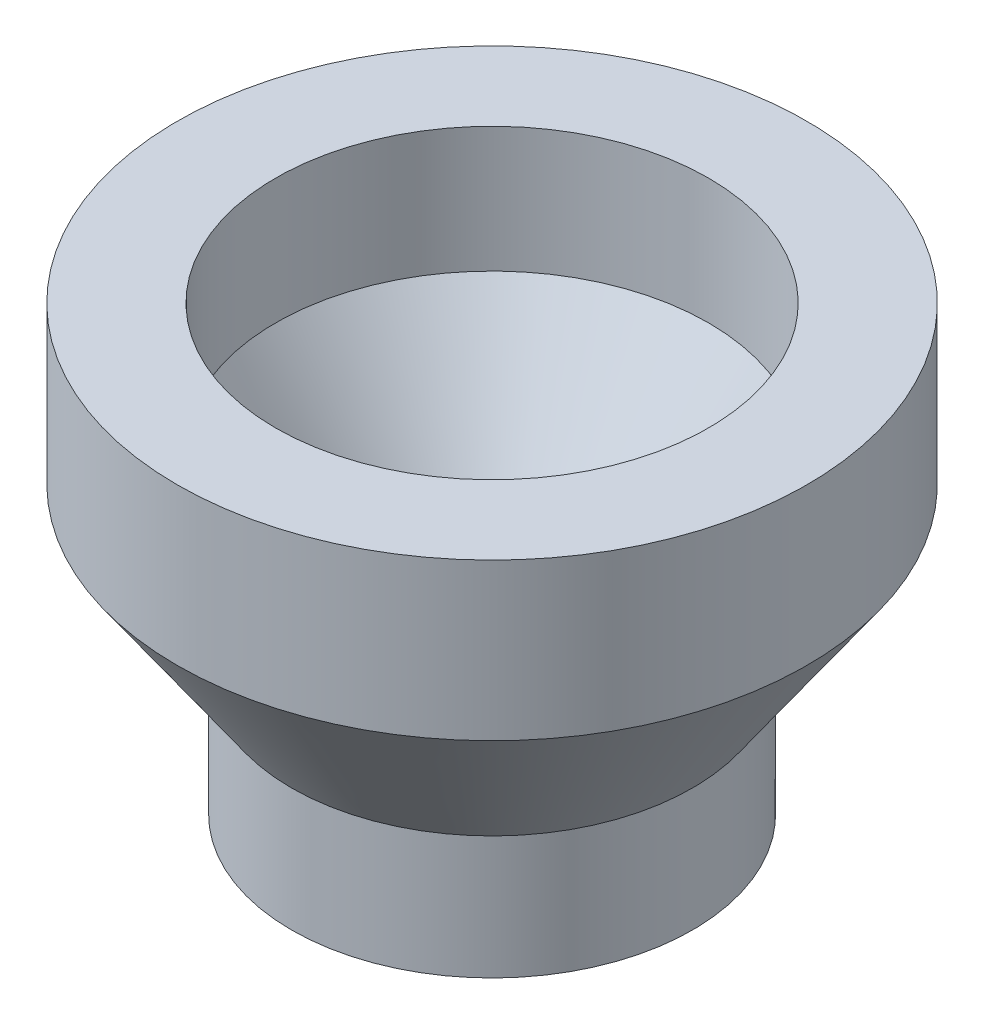
ISO-10303-21;
HEADER;
FILE_DESCRIPTION(('STEP AP214'),'2;1');
FILE_NAME('part.step','',(''),(''),'','','');
FILE_SCHEMA(('AUTOMOTIVE_DESIGN { 1 0 10303 214 1 1 1 1 }'));
ENDSEC;
DATA;
#1=APPLICATION_CONTEXT('core data for automotive mechanical design processes');
#2=APPLICATION_PROTOCOL_DEFINITION('international standard','automotive_design',2000,#1);
#3=PRODUCT_CONTEXT('',#1,'mechanical');
#4=PRODUCT('Part','Part','',(#3));
#5=PRODUCT_RELATED_PRODUCT_CATEGORY('part','',(#4));
#6=PRODUCT_DEFINITION_FORMATION('','',#4);
#7=PRODUCT_DEFINITION_CONTEXT('part definition',#1,'design');
#8=PRODUCT_DEFINITION('design','',#6,#7);
#9=PRODUCT_DEFINITION_SHAPE('','',#8);
#10=(LENGTH_UNIT() NAMED_UNIT(*) SI_UNIT(.MILLI.,.METRE.));
#11=(NAMED_UNIT(*) PLANE_ANGLE_UNIT() SI_UNIT($,.RADIAN.));
#12=(NAMED_UNIT(*) SI_UNIT($,.STERADIAN.) SOLID_ANGLE_UNIT());
#13=UNCERTAINTY_MEASURE_WITH_UNIT(LENGTH_MEASURE(1.E-05),#10,'distance_accuracy_value','');
#14=(GEOMETRIC_REPRESENTATION_CONTEXT(3) GLOBAL_UNCERTAINTY_ASSIGNED_CONTEXT((#13)) GLOBAL_UNIT_ASSIGNED_CONTEXT((#10,
#11,#12)) REPRESENTATION_CONTEXT('',''));
#15=CARTESIAN_POINT('',(0.,0.,0.));
#16=DIRECTION('',(0.,0.,1.));
#17=DIRECTION('',(1.,0.,0.));
#18=AXIS2_PLACEMENT_3D('',#15,#16,#17);
#19=CARTESIAN_POINT('',(-4.07499999999999,25.4372825671926,0.));
#20=DIRECTION('',(0.,-1.,0.));
#21=DIRECTION('',(0.,0.,-1.));
#22=AXIS2_PLACEMENT_3D('',#19,#20,#21);
#23=PLANE('',#22);
#24=CARTESIAN_POINT('',(0.,25.4372825671926,0.));
#25=DIRECTION('',(0.,1.,0.));
#26=DIRECTION('',(0.,0.,1.));
#27=AXIS2_PLACEMENT_3D('',#24,#25,#26);
#28=CIRCLE('',#27,2.57499999999999);
#29=CARTESIAN_POINT('',(0.,25.4372825671926,2.57499999999999));
#30=VERTEX_POINT('',#29);
#31=EDGE_CURVE('E10',#30,#30,#28,.T.);
#32=ORIENTED_EDGE('',*,*,#31,.T.);
#33=EDGE_LOOP('',(#32));
#34=FACE_BOUND('',#33,.T.);
#35=CARTESIAN_POINT('',(0.,25.4372825671926,0.));
#36=DIRECTION('',(0.,1.,0.));
#37=DIRECTION('',(0.,0.,1.));
#38=AXIS2_PLACEMENT_3D('',#35,#36,#37);
#39=CIRCLE('',#38,4.07499999999999);
#40=CARTESIAN_POINT('',(0.,25.4372825671926,4.07499999999999));
#41=VERTEX_POINT('',#40);
#42=EDGE_CURVE('E65',#41,#41,#39,.T.);
#43=ORIENTED_EDGE('',*,*,#42,.F.);
#44=EDGE_LOOP('',(#43));
#45=FACE_BOUND('',#44,.T.);
#46=ADVANCED_FACE('F37',(#34,#45),#23,.T.);
#47=CARTESIAN_POINT('',(0.,71.4914916516804,0.));
#48=DIRECTION('',(0.,1.,0.));
#49=DIRECTION('',(0.,0.,1.));
#50=AXIS2_PLACEMENT_3D('',#47,#48,#49);
#51=CYLINDRICAL_SURFACE('',#50,2.57499999999999);
#52=CARTESIAN_POINT('',(0.,29.2819541483216,0.));
#53=DIRECTION('',(0.,1.,0.));
#54=DIRECTION('',(0.,0.,1.));
#55=AXIS2_PLACEMENT_3D('',#52,#53,#54);
#56=CIRCLE('',#55,2.57499999999999);
#57=CARTESIAN_POINT('',(0.,29.2819541483216,2.57499999999999));
#58=VERTEX_POINT('',#57);
#59=EDGE_CURVE('E43',#58,#58,#56,.T.);
#60=ORIENTED_EDGE('',*,*,#59,.T.);
#61=EDGE_LOOP('',(#60));
#62=FACE_BOUND('',#61,.T.);
#63=ORIENTED_EDGE('',*,*,#31,.F.);
#64=EDGE_LOOP('',(#63));
#65=FACE_BOUND('',#64,.T.);
#66=ADVANCED_FACE('F73',(#62,#65),#51,.F.);
#67=CARTESIAN_POINT('',(0.,29.2819541483216,0.));
#68=DIRECTION('',(0.,1.,0.));
#69=DIRECTION('',(0.,0.,1.));
#70=AXIS2_PLACEMENT_3D('',#67,#68,#69);
#71=CONICAL_SURFACE('',#70,2.57499999999999,0.610865238198016);
#72=CARTESIAN_POINT('',(0.,31.8883242606259,0.));
#73=DIRECTION('',(0.,1.,0.));
#74=DIRECTION('',(0.,0.,1.));
#75=AXIS2_PLACEMENT_3D('',#72,#73,#74);
#76=CIRCLE('',#75,4.4);
#77=CARTESIAN_POINT('',(0.,31.8883242606259,4.4));
#78=VERTEX_POINT('',#77);
#79=EDGE_CURVE('E47',#78,#78,#76,.T.);
#80=ORIENTED_EDGE('',*,*,#79,.T.);
#81=EDGE_LOOP('',(#80));
#82=FACE_BOUND('',#81,.T.);
#83=ORIENTED_EDGE('',*,*,#59,.F.);
#84=EDGE_LOOP('',(#83));
#85=FACE_BOUND('',#84,.T.);
#86=ADVANCED_FACE('F77',(#82,#85),#71,.F.);
#87=CARTESIAN_POINT('',(0.,71.4914916516804,0.));
#88=DIRECTION('',(0.,1.,0.));
#89=DIRECTION('',(0.,0.,1.));
#90=AXIS2_PLACEMENT_3D('',#87,#88,#89);
#91=CYLINDRICAL_SURFACE('',#90,4.4);
#92=CARTESIAN_POINT('',(0.,34.4372825671926,0.));
#93=DIRECTION('',(0.,1.,0.));
#94=DIRECTION('',(0.,0.,1.));
#95=AXIS2_PLACEMENT_3D('',#92,#93,#94);
#96=CIRCLE('',#95,4.4);
#97=CARTESIAN_POINT('',(0.,34.4372825671926,4.4));
#98=VERTEX_POINT('',#97);
#99=EDGE_CURVE('E51',#98,#98,#96,.T.);
#100=ORIENTED_EDGE('',*,*,#99,.T.);
#101=EDGE_LOOP('',(#100));
#102=FACE_BOUND('',#101,.T.);
#103=ORIENTED_EDGE('',*,*,#79,.F.);
#104=EDGE_LOOP('',(#103));
#105=FACE_BOUND('',#104,.T.);
#106=ADVANCED_FACE('F81',(#102,#105),#91,.F.);
#107=CARTESIAN_POINT('',(-4.4,34.4372825671926,0.));
#108=DIRECTION('',(0.,1.,0.));
#109=DIRECTION('',(0.,0.,1.));
#110=AXIS2_PLACEMENT_3D('',#107,#108,#109);
#111=PLANE('',#110);
#112=CARTESIAN_POINT('',(0.,34.4372825671926,0.));
#113=DIRECTION('',(0.,1.,0.));
#114=DIRECTION('',(0.,0.,1.));
#115=AXIS2_PLACEMENT_3D('',#112,#113,#114);
#116=CIRCLE('',#115,6.4);
#117=CARTESIAN_POINT('',(0.,34.4372825671926,6.4));
#118=VERTEX_POINT('',#117);
#119=EDGE_CURVE('E56',#118,#118,#116,.T.);
#120=ORIENTED_EDGE('',*,*,#119,.T.);
#121=EDGE_LOOP('',(#120));
#122=FACE_BOUND('',#121,.T.);
#123=ORIENTED_EDGE('',*,*,#99,.F.);
#124=EDGE_LOOP('',(#123));
#125=FACE_BOUND('',#124,.T.);
#126=ADVANCED_FACE('F88',(#122,#125),#111,.T.);
#127=CARTESIAN_POINT('',(0.,71.4914916516804,0.));
#128=DIRECTION('',(0.,1.,0.));
#129=DIRECTION('',(0.,0.,1.));
#130=AXIS2_PLACEMENT_3D('',#127,#128,#129);
#131=CYLINDRICAL_SURFACE('',#130,6.4);
#132=CARTESIAN_POINT('',(0.,31.257726682868,0.));
#133=DIRECTION('',(0.,1.,0.));
#134=DIRECTION('',(0.,0.,1.));
#135=AXIS2_PLACEMENT_3D('',#132,#133,#134);
#136=CIRCLE('',#135,6.4);
#137=CARTESIAN_POINT('',(0.,31.257726682868,6.4));
#138=VERTEX_POINT('',#137);
#139=EDGE_CURVE('E59',#138,#138,#136,.T.);
#140=ORIENTED_EDGE('',*,*,#139,.T.);
#141=EDGE_LOOP('',(#140));
#142=FACE_BOUND('',#141,.T.);
#143=ORIENTED_EDGE('',*,*,#119,.F.);
#144=EDGE_LOOP('',(#143));
#145=FACE_BOUND('',#144,.T.);
#146=ADVANCED_FACE('F92',(#142,#145),#131,.T.);
#147=CARTESIAN_POINT('',(0.,31.257726682868,0.));
#148=DIRECTION('',(0.,1.,0.));
#149=DIRECTION('',(0.,0.,1.));
#150=AXIS2_PLACEMENT_3D('',#147,#148,#149);
#151=CONICAL_SURFACE('',#150,6.4,0.610865238198016);
#152=CARTESIAN_POINT('',(0.,27.9372825671926,0.));
#153=DIRECTION('',(0.,1.,0.));
#154=DIRECTION('',(0.,0.,1.));
#155=AXIS2_PLACEMENT_3D('',#152,#153,#154);
#156=CIRCLE('',#155,4.07499999999999);
#157=CARTESIAN_POINT('',(0.,27.9372825671926,4.07499999999999));
#158=VERTEX_POINT('',#157);
#159=EDGE_CURVE('E62',#158,#158,#156,.T.);
#160=ORIENTED_EDGE('',*,*,#159,.T.);
#161=EDGE_LOOP('',(#160));
#162=FACE_BOUND('',#161,.T.);
#163=ORIENTED_EDGE('',*,*,#139,.F.);
#164=EDGE_LOOP('',(#163));
#165=FACE_BOUND('',#164,.T.);
#166=ADVANCED_FACE('F96',(#162,#165),#151,.T.);
#167=CARTESIAN_POINT('',(0.,71.4914916516804,0.));
#168=DIRECTION('',(0.,1.,0.));
#169=DIRECTION('',(0.,0.,1.));
#170=AXIS2_PLACEMENT_3D('',#167,#168,#169);
#171=CYLINDRICAL_SURFACE('',#170,4.07499999999999);
#172=ORIENTED_EDGE('',*,*,#42,.T.);
#173=EDGE_LOOP('',(#172));
#174=FACE_BOUND('',#173,.T.);
#175=ORIENTED_EDGE('',*,*,#159,.F.);
#176=EDGE_LOOP('',(#175));
#177=FACE_BOUND('',#176,.T.);
#178=ADVANCED_FACE('F69',(#174,#177),#171,.T.);
#179=CLOSED_SHELL('',(#46,#66,#86,#106,#126,#146,#166,#178));
#180=MANIFOLD_SOLID_BREP('B2',#179);
#181=ADVANCED_BREP_SHAPE_REPRESENTATION('',(#18,#180),#14);
#182=SHAPE_DEFINITION_REPRESENTATION(#9,#181);
ENDSEC;
END-ISO-10303-21;
